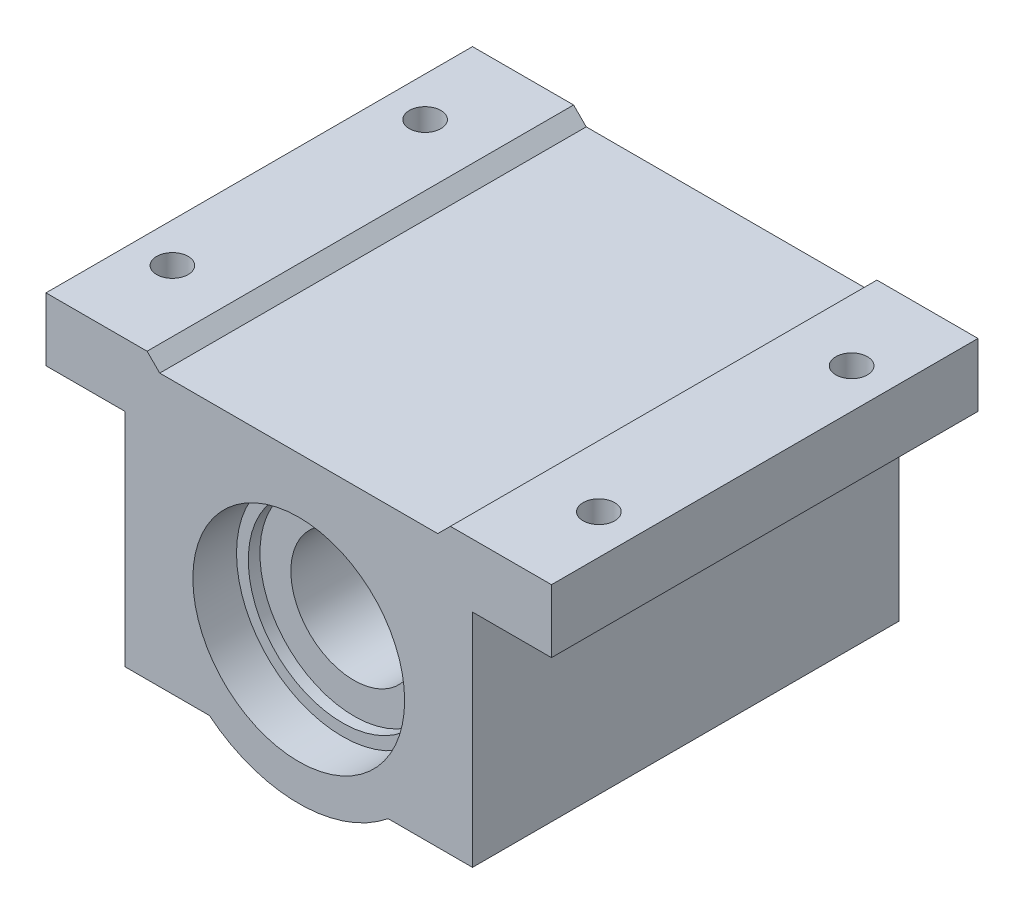
ISO-10303-21;
HEADER;
FILE_DESCRIPTION(('STEP AP214'),'2;1');
FILE_NAME('part.step','',(''),(''),'','','');
FILE_SCHEMA(('AUTOMOTIVE_DESIGN { 1 0 10303 214 1 1 1 1 }'));
ENDSEC;
DATA;
#1=APPLICATION_CONTEXT('core data for automotive mechanical design processes');
#2=APPLICATION_PROTOCOL_DEFINITION('international standard','automotive_design',2000,#1);
#3=PRODUCT_CONTEXT('',#1,'mechanical');
#4=PRODUCT('Part','Part','',(#3));
#5=PRODUCT_RELATED_PRODUCT_CATEGORY('part','',(#4));
#6=PRODUCT_DEFINITION_FORMATION('','',#4);
#7=PRODUCT_DEFINITION_CONTEXT('part definition',#1,'design');
#8=PRODUCT_DEFINITION('design','',#6,#7);
#9=PRODUCT_DEFINITION_SHAPE('','',#8);
#10=(LENGTH_UNIT() NAMED_UNIT(*) SI_UNIT(.MILLI.,.METRE.));
#11=(NAMED_UNIT(*) PLANE_ANGLE_UNIT() SI_UNIT($,.RADIAN.));
#12=(NAMED_UNIT(*) SI_UNIT($,.STERADIAN.) SOLID_ANGLE_UNIT());
#13=UNCERTAINTY_MEASURE_WITH_UNIT(LENGTH_MEASURE(1.E-05),#10,'distance_accuracy_value','');
#14=(GEOMETRIC_REPRESENTATION_CONTEXT(3) GLOBAL_UNCERTAINTY_ASSIGNED_CONTEXT((#13)) GLOBAL_UNIT_ASSIGNED_CONTEXT((#10,
#11,#12)) REPRESENTATION_CONTEXT('',''));
#15=CARTESIAN_POINT('',(0.,0.,0.));
#16=DIRECTION('',(0.,0.,1.));
#17=DIRECTION('',(1.,0.,0.));
#18=AXIS2_PLACEMENT_3D('',#15,#16,#17);
#19=CARTESIAN_POINT('',(0.,0.,15.875));
#20=DIRECTION('',(0.,0.,1.));
#21=DIRECTION('',(1.,0.,0.));
#22=AXIS2_PLACEMENT_3D('',#19,#20,#21);
#23=CYLINDRICAL_SURFACE('',#22,11.8237);
#24=CARTESIAN_POINT('',(0.,0.,15.875));
#25=DIRECTION('',(0.,0.,1.));
#26=DIRECTION('',(1.,0.,0.));
#27=AXIS2_PLACEMENT_3D('',#24,#25,#26);
#28=CIRCLE('',#27,11.8237);
#29=CARTESIAN_POINT('',(11.8237,0.,15.875));
#30=VERTEX_POINT('',#29);
#31=EDGE_CURVE('E11',#30,#30,#28,.T.);
#32=ORIENTED_EDGE('',*,*,#31,.T.);
#33=EDGE_LOOP('',(#32));
#34=FACE_BOUND('',#33,.T.);
#35=CARTESIAN_POINT('',(0.,0.,17.0434));
#36=DIRECTION('',(0.,0.,1.));
#37=DIRECTION('',(1.,0.,0.));
#38=AXIS2_PLACEMENT_3D('',#35,#36,#37);
#39=CIRCLE('',#38,11.8237);
#40=CARTESIAN_POINT('',(11.8237,0.,17.0434));
#41=VERTEX_POINT('',#40);
#42=EDGE_CURVE('E55',#41,#41,#39,.T.);
#43=ORIENTED_EDGE('',*,*,#42,.F.);
#44=EDGE_LOOP('',(#43));
#45=FACE_BOUND('',#44,.T.);
#46=ADVANCED_FACE('F41',(#34,#45),#23,.T.);
#47=CARTESIAN_POINT('',(0.,9.45896,15.875));
#48=DIRECTION('',(0.,0.,-1.));
#49=DIRECTION('',(-1.,0.,0.));
#50=AXIS2_PLACEMENT_3D('',#47,#48,#49);
#51=PLANE('',#50);
#52=CARTESIAN_POINT('',(0.,0.,15.875));
#53=DIRECTION('',(0.,0.,1.));
#54=DIRECTION('',(1.,0.,0.));
#55=AXIS2_PLACEMENT_3D('',#52,#53,#54);
#56=CIRCLE('',#55,9.45896);
#57=CARTESIAN_POINT('',(9.45896,0.,15.875));
#58=VERTEX_POINT('',#57);
#59=EDGE_CURVE('E47',#58,#58,#56,.T.);
#60=ORIENTED_EDGE('',*,*,#59,.T.);
#61=EDGE_LOOP('',(#60));
#62=FACE_BOUND('',#61,.T.);
#63=ORIENTED_EDGE('',*,*,#31,.F.);
#64=EDGE_LOOP('',(#63));
#65=FACE_BOUND('',#64,.T.);
#66=ADVANCED_FACE('F65',(#62,#65),#51,.T.);
#67=CARTESIAN_POINT('',(0.,0.,15.875));
#68=DIRECTION('',(0.,0.,1.));
#69=DIRECTION('',(1.,0.,0.));
#70=AXIS2_PLACEMENT_3D('',#67,#68,#69);
#71=CYLINDRICAL_SURFACE('',#70,9.45896);
#72=CARTESIAN_POINT('',(0.,0.,17.0434));
#73=DIRECTION('',(0.,0.,1.));
#74=DIRECTION('',(1.,0.,0.));
#75=AXIS2_PLACEMENT_3D('',#72,#73,#74);
#76=CIRCLE('',#75,9.45896);
#77=CARTESIAN_POINT('',(9.45896,0.,17.0434));
#78=VERTEX_POINT('',#77);
#79=EDGE_CURVE('E51',#78,#78,#76,.T.);
#80=ORIENTED_EDGE('',*,*,#79,.T.);
#81=EDGE_LOOP('',(#80));
#82=FACE_BOUND('',#81,.T.);
#83=ORIENTED_EDGE('',*,*,#59,.F.);
#84=EDGE_LOOP('',(#83));
#85=FACE_BOUND('',#84,.T.);
#86=ADVANCED_FACE('F69',(#82,#85),#71,.F.);
#87=CARTESIAN_POINT('',(0.,9.45896,17.0434));
#88=DIRECTION('',(0.,0.,1.));
#89=DIRECTION('',(1.,0.,0.));
#90=AXIS2_PLACEMENT_3D('',#87,#88,#89);
#91=PLANE('',#90);
#92=ORIENTED_EDGE('',*,*,#42,.T.);
#93=EDGE_LOOP('',(#92));
#94=FACE_BOUND('',#93,.T.);
#95=ORIENTED_EDGE('',*,*,#79,.F.);
#96=EDGE_LOOP('',(#95));
#97=FACE_BOUND('',#96,.T.);
#98=ADVANCED_FACE('F61',(#94,#97),#91,.T.);
#99=CLOSED_SHELL('',(#46,#66,#86,#98));
#100=MANIFOLD_SOLID_BREP('B2',#99);
#101=CARTESIAN_POINT('',(0.,0.,15.875));
#102=DIRECTION('',(0.,0.,1.));
#103=DIRECTION('',(1.,0.,0.));
#104=AXIS2_PLACEMENT_3D('',#101,#102,#103);
#105=CYLINDRICAL_SURFACE('',#104,11.8237);
#106=CARTESIAN_POINT('',(0.,0.,-17.0434));
#107=DIRECTION('',(0.,0.,1.));
#108=DIRECTION('',(1.,0.,0.));
#109=AXIS2_PLACEMENT_3D('',#106,#107,#108);
#110=CIRCLE('',#109,11.8237);
#111=CARTESIAN_POINT('',(11.8237,0.,-17.0434));
#112=VERTEX_POINT('',#111);
#113=EDGE_CURVE('E124',#112,#112,#110,.T.);
#114=ORIENTED_EDGE('',*,*,#113,.T.);
#115=EDGE_LOOP('',(#114));
#116=FACE_BOUND('',#115,.T.);
#117=CARTESIAN_POINT('',(0.,0.,-15.875));
#118=DIRECTION('',(0.,0.,1.));
#119=DIRECTION('',(1.,0.,0.));
#120=AXIS2_PLACEMENT_3D('',#117,#118,#119);
#121=CIRCLE('',#120,11.8237);
#122=CARTESIAN_POINT('',(11.8237,0.,-15.875));
#123=VERTEX_POINT('',#122);
#124=EDGE_CURVE('E40',#123,#123,#121,.T.);
#125=ORIENTED_EDGE('',*,*,#124,.F.);
#126=EDGE_LOOP('',(#125));
#127=FACE_BOUND('',#126,.T.);
#128=ADVANCED_FACE('F110',(#116,#127),#105,.T.);
#129=CARTESIAN_POINT('',(0.,9.45896,-15.875));
#130=DIRECTION('',(0.,0.,1.));
#131=DIRECTION('',(1.,0.,0.));
#132=AXIS2_PLACEMENT_3D('',#129,#130,#131);
#133=PLANE('',#132);
#134=ORIENTED_EDGE('',*,*,#124,.T.);
#135=EDGE_LOOP('',(#134));
#136=FACE_BOUND('',#135,.T.);
#137=CARTESIAN_POINT('',(0.,0.,-15.875));
#138=DIRECTION('',(0.,0.,1.));
#139=DIRECTION('',(1.,0.,0.));
#140=AXIS2_PLACEMENT_3D('',#137,#138,#139);
#141=CIRCLE('',#140,9.45896);
#142=CARTESIAN_POINT('',(9.45896,0.,-15.875));
#143=VERTEX_POINT('',#142);
#144=EDGE_CURVE('E116',#143,#143,#141,.T.);
#145=ORIENTED_EDGE('',*,*,#144,.F.);
#146=EDGE_LOOP('',(#145));
#147=FACE_BOUND('',#146,.T.);
#148=ADVANCED_FACE('F140',(#136,#147),#133,.T.);
#149=CARTESIAN_POINT('',(0.,0.,15.875));
#150=DIRECTION('',(0.,0.,1.));
#151=DIRECTION('',(1.,0.,0.));
#152=AXIS2_PLACEMENT_3D('',#149,#150,#151);
#153=CYLINDRICAL_SURFACE('',#152,9.45896);
#154=ORIENTED_EDGE('',*,*,#144,.T.);
#155=EDGE_LOOP('',(#154));
#156=FACE_BOUND('',#155,.T.);
#157=CARTESIAN_POINT('',(0.,0.,-17.0434));
#158=DIRECTION('',(0.,0.,1.));
#159=DIRECTION('',(1.,0.,0.));
#160=AXIS2_PLACEMENT_3D('',#157,#158,#159);
#161=CIRCLE('',#160,9.45896);
#162=CARTESIAN_POINT('',(9.45896,0.,-17.0434));
#163=VERTEX_POINT('',#162);
#164=EDGE_CURVE('E120',#163,#163,#161,.T.);
#165=ORIENTED_EDGE('',*,*,#164,.F.);
#166=EDGE_LOOP('',(#165));
#167=FACE_BOUND('',#166,.T.);
#168=ADVANCED_FACE('F134',(#156,#167),#153,.F.);
#169=CARTESIAN_POINT('',(0.,9.45896,-17.0434));
#170=DIRECTION('',(0.,0.,-1.));
#171=DIRECTION('',(-1.,0.,0.));
#172=AXIS2_PLACEMENT_3D('',#169,#170,#171);
#173=PLANE('',#172);
#174=ORIENTED_EDGE('',*,*,#164,.T.);
#175=EDGE_LOOP('',(#174));
#176=FACE_BOUND('',#175,.T.);
#177=ORIENTED_EDGE('',*,*,#113,.F.);
#178=EDGE_LOOP('',(#177));
#179=FACE_BOUND('',#178,.T.);
#180=ADVANCED_FACE('F132',(#176,#179),#173,.T.);
#181=CLOSED_SHELL('',(#128,#148,#168,#180));
#182=MANIFOLD_SOLID_BREP('B6',#181);
#183=CARTESIAN_POINT('',(0.,0.,15.875));
#184=DIRECTION('',(0.,0.,1.));
#185=DIRECTION('',(1.,0.,0.));
#186=AXIS2_PLACEMENT_3D('',#183,#184,#185);
#187=PLANE('',#186);
#188=CARTESIAN_POINT('',(0.,0.,15.875));
#189=DIRECTION('',(0.,0.,1.));
#190=DIRECTION('',(1.,0.,0.));
#191=AXIS2_PLACEMENT_3D('',#188,#189,#190);
#192=CIRCLE('',#191,10.64133);
#193=CARTESIAN_POINT('',(10.64133,0.,15.875));
#194=VERTEX_POINT('',#193);
#195=EDGE_CURVE('E109',#194,#194,#192,.T.);
#196=ORIENTED_EDGE('',*,*,#195,.T.);
#197=EDGE_LOOP('',(#196));
#198=FACE_BOUND('',#197,.T.);
#199=CARTESIAN_POINT('',(0.,0.,15.875));
#200=DIRECTION('',(0.,0.,1.));
#201=DIRECTION('',(1.,0.,0.));
#202=AXIS2_PLACEMENT_3D('',#199,#200,#201);
#203=CIRCLE('',#202,6.35);
#204=CARTESIAN_POINT('',(6.35,0.,15.875));
#205=VERTEX_POINT('',#204);
#206=EDGE_CURVE('E191',#205,#205,#203,.T.);
#207=ORIENTED_EDGE('',*,*,#206,.F.);
#208=EDGE_LOOP('',(#207));
#209=FACE_BOUND('',#208,.T.);
#210=ADVANCED_FACE('F180',(#198,#209),#187,.T.);
#211=CARTESIAN_POINT('',(0.,0.,-15.875));
#212=DIRECTION('',(0.,0.,1.));
#213=DIRECTION('',(1.,0.,0.));
#214=AXIS2_PLACEMENT_3D('',#211,#212,#213);
#215=PLANE('',#214);
#216=CARTESIAN_POINT('',(0.,0.,-15.875));
#217=DIRECTION('',(0.,0.,1.));
#218=DIRECTION('',(1.,0.,0.));
#219=AXIS2_PLACEMENT_3D('',#216,#217,#218);
#220=CIRCLE('',#219,10.64133);
#221=CARTESIAN_POINT('',(10.64133,0.,-15.875));
#222=VERTEX_POINT('',#221);
#223=EDGE_CURVE('E184',#222,#222,#220,.T.);
#224=ORIENTED_EDGE('',*,*,#223,.F.);
#225=EDGE_LOOP('',(#224));
#226=FACE_BOUND('',#225,.T.);
#227=CARTESIAN_POINT('',(0.,0.,-15.875));
#228=DIRECTION('',(0.,0.,1.));
#229=DIRECTION('',(1.,0.,0.));
#230=AXIS2_PLACEMENT_3D('',#227,#228,#229);
#231=CIRCLE('',#230,6.35);
#232=CARTESIAN_POINT('',(6.35,0.,-15.875));
#233=VERTEX_POINT('',#232);
#234=EDGE_CURVE('E193',#233,#233,#231,.T.);
#235=ORIENTED_EDGE('',*,*,#234,.T.);
#236=EDGE_LOOP('',(#235));
#237=FACE_BOUND('',#236,.T.);
#238=ADVANCED_FACE('F203',(#226,#237),#215,.F.);
#239=CARTESIAN_POINT('',(0.,0.,15.875));
#240=DIRECTION('',(0.,0.,-1.));
#241=DIRECTION('',(-1.,0.,0.));
#242=AXIS2_PLACEMENT_3D('',#239,#240,#241);
#243=CYLINDRICAL_SURFACE('',#242,10.64133);
#244=ORIENTED_EDGE('',*,*,#195,.F.);
#245=EDGE_LOOP('',(#244));
#246=FACE_BOUND('',#245,.T.);
#247=ORIENTED_EDGE('',*,*,#223,.T.);
#248=EDGE_LOOP('',(#247));
#249=FACE_BOUND('',#248,.T.);
#250=ADVANCED_FACE('F182',(#246,#249),#243,.T.);
#251=CARTESIAN_POINT('',(0.,0.,15.875));
#252=DIRECTION('',(0.,0.,-1.));
#253=DIRECTION('',(-1.,0.,0.));
#254=AXIS2_PLACEMENT_3D('',#251,#252,#253);
#255=CYLINDRICAL_SURFACE('',#254,6.35);
#256=ORIENTED_EDGE('',*,*,#206,.T.);
#257=EDGE_LOOP('',(#256));
#258=FACE_BOUND('',#257,.T.);
#259=ORIENTED_EDGE('',*,*,#234,.F.);
#260=EDGE_LOOP('',(#259));
#261=FACE_BOUND('',#260,.T.);
#262=ADVANCED_FACE('F199',(#258,#261),#255,.F.);
#263=CLOSED_SHELL('',(#210,#238,#250,#262));
#264=MANIFOLD_SOLID_BREP('B35',#263);
#265=CARTESIAN_POINT('',(0.,0.,21.43125));
#266=DIRECTION('',(0.,0.,-1.));
#267=DIRECTION('',(-1.,0.,0.));
#268=AXIS2_PLACEMENT_3D('',#265,#266,#267);
#269=CYLINDRICAL_SURFACE('',#268,10.64133);
#270=CARTESIAN_POINT('',(0.,0.,15.875));
#271=DIRECTION('',(0.,0.,-1.));
#272=DIRECTION('',(-1.,0.,0.));
#273=AXIS2_PLACEMENT_3D('',#270,#271,#272);
#274=CIRCLE('',#273,10.64133);
#275=CARTESIAN_POINT('',(-10.64133,0.,15.875));
#276=VERTEX_POINT('',#275);
#277=EDGE_CURVE('E245',#276,#276,#274,.T.);
#278=ORIENTED_EDGE('',*,*,#277,.F.);
#279=EDGE_LOOP('',(#278));
#280=FACE_BOUND('',#279,.T.);
#281=CARTESIAN_POINT('',(0.,0.,-15.875));
#282=DIRECTION('',(0.,0.,1.));
#283=DIRECTION('',(1.,0.,0.));
#284=AXIS2_PLACEMENT_3D('',#281,#282,#283);
#285=CIRCLE('',#284,10.64133);
#286=CARTESIAN_POINT('',(10.64133,0.,-15.875));
#287=VERTEX_POINT('',#286);
#288=EDGE_CURVE('E437',#287,#287,#285,.T.);
#289=ORIENTED_EDGE('',*,*,#288,.F.);
#290=EDGE_LOOP('',(#289));
#291=FACE_BOUND('',#290,.T.);
#292=ADVANCED_FACE('F241',(#280,#291),#269,.F.);
#293=CARTESIAN_POINT('',(0.,0.,17.0434));
#294=DIRECTION('',(0.,0.,1.));
#295=DIRECTION('',(1.,0.,0.));
#296=AXIS2_PLACEMENT_3D('',#293,#294,#295);
#297=CIRCLE('',#296,10.64133);
#298=CARTESIAN_POINT('',(10.64133,0.,17.0434));
#299=VERTEX_POINT('',#298);
#300=EDGE_CURVE('E441',#299,#299,#297,.T.);
#301=ORIENTED_EDGE('',*,*,#300,.F.);
#302=EDGE_LOOP('',(#301));
#303=FACE_BOUND('',#302,.T.);
#304=CARTESIAN_POINT('',(0.,0.,21.43125));
#305=DIRECTION('',(0.,0.,1.));
#306=DIRECTION('',(1.,0.,0.));
#307=AXIS2_PLACEMENT_3D('',#304,#305,#306);
#308=CIRCLE('',#307,10.64133);
#309=CARTESIAN_POINT('',(10.64133,0.,21.43125));
#310=VERTEX_POINT('',#309);
#311=EDGE_CURVE('E381',#310,#310,#308,.T.);
#312=ORIENTED_EDGE('',*,*,#311,.T.);
#313=EDGE_LOOP('',(#312));
#314=FACE_BOUND('',#313,.T.);
#315=ADVANCED_FACE('F534',(#303,#314),#269,.F.);
#316=CARTESIAN_POINT('',(0.,0.,21.43125));
#317=DIRECTION('',(0.,0.,1.));
#318=DIRECTION('',(1.,0.,0.));
#319=AXIS2_PLACEMENT_3D('',#316,#317,#318);
#320=PLANE('',#319);
#321=DIRECTION('',(0.,1.,0.));
#322=VECTOR('',#321,1.);
#323=CARTESIAN_POINT('',(17.4625,-11.1125,21.43125));
#324=LINE('',#323,#322);
#325=CARTESIAN_POINT('',(17.4625,-11.1125,21.43125));
#326=VERTEX_POINT('',#325);
#327=CARTESIAN_POINT('',(17.4625,11.1125,21.43125));
#328=VERTEX_POINT('',#327);
#329=EDGE_CURVE('E404',#326,#328,#324,.T.);
#330=ORIENTED_EDGE('',*,*,#329,.T.);
#331=DIRECTION('',(1.,0.,0.));
#332=VECTOR('',#331,1.);
#333=CARTESIAN_POINT('',(17.4625,11.1125,21.43125));
#334=LINE('',#333,#332);
#335=CARTESIAN_POINT('',(25.4,11.1125,21.43125));
#336=VERTEX_POINT('',#335);
#337=EDGE_CURVE('E321',#328,#336,#334,.T.);
#338=ORIENTED_EDGE('',*,*,#337,.T.);
#339=DIRECTION('',(0.,1.,0.));
#340=VECTOR('',#339,1.);
#341=CARTESIAN_POINT('',(25.4,11.1125,21.43125));
#342=LINE('',#341,#340);
#343=CARTESIAN_POINT('',(25.4,17.4625,21.43125));
#344=VERTEX_POINT('',#343);
#345=EDGE_CURVE('E490',#336,#344,#342,.T.);
#346=ORIENTED_EDGE('',*,*,#345,.T.);
#347=DIRECTION('',(-1.,0.,0.));
#348=VECTOR('',#347,1.);
#349=CARTESIAN_POINT('',(15.24,17.4625,21.43125));
#350=LINE('',#349,#348);
#351=CARTESIAN_POINT('',(15.24,17.4625,21.43125));
#352=VERTEX_POINT('',#351);
#353=EDGE_CURVE('E492',#344,#352,#350,.T.);
#354=ORIENTED_EDGE('',*,*,#353,.T.);
#355=DIRECTION('',(-0.707106781186547,-0.707106781186549,0.));
#356=VECTOR('',#355,1.);
#357=CARTESIAN_POINT('',(13.97,16.1925,21.43125));
#358=LINE('',#357,#356);
#359=CARTESIAN_POINT('',(13.97,16.1925,21.43125));
#360=VERTEX_POINT('',#359);
#361=EDGE_CURVE('E494',#352,#360,#358,.T.);
#362=ORIENTED_EDGE('',*,*,#361,.T.);
#363=DIRECTION('',(-1.,0.,0.));
#364=VECTOR('',#363,1.);
#365=CARTESIAN_POINT('',(-13.97,16.1925,21.43125));
#366=LINE('',#365,#364);
#367=CARTESIAN_POINT('',(-13.97,16.1925,21.43125));
#368=VERTEX_POINT('',#367);
#369=EDGE_CURVE('E496',#360,#368,#366,.T.);
#370=ORIENTED_EDGE('',*,*,#369,.T.);
#371=DIRECTION('',(-0.707106781186543,0.707106781186552,0.));
#372=VECTOR('',#371,1.);
#373=CARTESIAN_POINT('',(-15.24,17.4625,21.43125));
#374=LINE('',#373,#372);
#375=CARTESIAN_POINT('',(-15.24,17.4625,21.43125));
#376=VERTEX_POINT('',#375);
#377=EDGE_CURVE('E498',#368,#376,#374,.T.);
#378=ORIENTED_EDGE('',*,*,#377,.T.);
#379=DIRECTION('',(-1.,0.,0.));
#380=VECTOR('',#379,1.);
#381=CARTESIAN_POINT('',(-15.24,17.4625,21.43125));
#382=LINE('',#381,#380);
#383=CARTESIAN_POINT('',(-25.4,17.4625,21.43125));
#384=VERTEX_POINT('',#383);
#385=EDGE_CURVE('E500',#376,#384,#382,.T.);
#386=ORIENTED_EDGE('',*,*,#385,.T.);
#387=DIRECTION('',(0.,-1.,0.));
#388=VECTOR('',#387,1.);
#389=CARTESIAN_POINT('',(-25.4,11.1125,21.43125));
#390=LINE('',#389,#388);
#391=CARTESIAN_POINT('',(-25.4,11.1125,21.43125));
#392=VERTEX_POINT('',#391);
#393=EDGE_CURVE('E502',#384,#392,#390,.T.);
#394=ORIENTED_EDGE('',*,*,#393,.T.);
#395=DIRECTION('',(1.,0.,0.));
#396=VECTOR('',#395,1.);
#397=CARTESIAN_POINT('',(-17.4625,11.1125,21.43125));
#398=LINE('',#397,#396);
#399=CARTESIAN_POINT('',(-17.4625,11.1125,21.43125));
#400=VERTEX_POINT('',#399);
#401=EDGE_CURVE('E504',#392,#400,#398,.T.);
#402=ORIENTED_EDGE('',*,*,#401,.T.);
#403=DIRECTION('',(0.,-1.,0.));
#404=VECTOR('',#403,1.);
#405=CARTESIAN_POINT('',(-17.4625,11.1125,21.43125));
#406=LINE('',#405,#404);
#407=CARTESIAN_POINT('',(-17.4625,-11.1125,21.43125));
#408=VERTEX_POINT('',#407);
#409=EDGE_CURVE('E359',#400,#408,#406,.T.);
#410=ORIENTED_EDGE('',*,*,#409,.T.);
#411=DIRECTION('',(1.,0.,0.));
#412=VECTOR('',#411,1.);
#413=CARTESIAN_POINT('',(-17.4625,-11.1125,21.43125));
#414=LINE('',#413,#412);
#415=CARTESIAN_POINT('',(-8.98025612106917,-11.1125,21.43125));
#416=VERTEX_POINT('',#415);
#417=EDGE_CURVE('E352',#408,#416,#414,.T.);
#418=ORIENTED_EDGE('',*,*,#417,.T.);
#419=CARTESIAN_POINT('',(0.,0.,21.43125));
#420=DIRECTION('',(0.,0.,1.));
#421=DIRECTION('',(1.,0.,0.));
#422=AXIS2_PLACEMENT_3D('',#419,#420,#421);
#423=CIRCLE('',#422,14.2875);
#424=CARTESIAN_POINT('',(8.98025612106917,-11.1125,21.43125));
#425=VERTEX_POINT('',#424);
#426=EDGE_CURVE('E357',#416,#425,#423,.T.);
#427=ORIENTED_EDGE('',*,*,#426,.T.);
#428=DIRECTION('',(1.,0.,0.));
#429=VECTOR('',#428,1.);
#430=CARTESIAN_POINT('',(8.98025612106917,-11.1125,21.43125));
#431=LINE('',#430,#429);
#432=EDGE_CURVE('E260',#425,#326,#431,.T.);
#433=ORIENTED_EDGE('',*,*,#432,.T.);
#434=EDGE_LOOP('',(#330,#338,#346,#354,#362,#370,#378,#386,#394,#402,#410,#418,#427,#433));
#435=FACE_BOUND('',#434,.T.);
#436=ORIENTED_EDGE('',*,*,#311,.F.);
#437=EDGE_LOOP('',(#436));
#438=FACE_BOUND('',#437,.T.);
#439=ADVANCED_FACE('F354',(#435,#438),#320,.T.);
#440=CARTESIAN_POINT('',(0.,0.,-21.43125));
#441=DIRECTION('',(0.,0.,1.));
#442=DIRECTION('',(1.,0.,0.));
#443=AXIS2_PLACEMENT_3D('',#440,#441,#442);
#444=PLANE('',#443);
#445=DIRECTION('',(0.,1.,0.));
#446=VECTOR('',#445,1.);
#447=CARTESIAN_POINT('',(17.4625,-11.1125,-21.43125));
#448=LINE('',#447,#446);
#449=CARTESIAN_POINT('',(17.4625,-11.1125,-21.43125));
#450=VERTEX_POINT('',#449);
#451=CARTESIAN_POINT('',(17.4625,11.1125,-21.43125));
#452=VERTEX_POINT('',#451);
#453=EDGE_CURVE('E377',#450,#452,#448,.T.);
#454=ORIENTED_EDGE('',*,*,#453,.F.);
#455=DIRECTION('',(1.,0.,0.));
#456=VECTOR('',#455,1.);
#457=CARTESIAN_POINT('',(8.98025612106917,-11.1125,-21.43125));
#458=LINE('',#457,#456);
#459=CARTESIAN_POINT('',(8.98025612106917,-11.1125,-21.43125));
#460=VERTEX_POINT('',#459);
#461=EDGE_CURVE('E313',#460,#450,#458,.T.);
#462=ORIENTED_EDGE('',*,*,#461,.F.);
#463=CARTESIAN_POINT('',(0.,0.,-21.43125));
#464=DIRECTION('',(0.,0.,1.));
#465=DIRECTION('',(1.,0.,0.));
#466=AXIS2_PLACEMENT_3D('',#463,#464,#465);
#467=CIRCLE('',#466,14.2875);
#468=CARTESIAN_POINT('',(-8.98025612106917,-11.1125,-21.43125));
#469=VERTEX_POINT('',#468);
#470=EDGE_CURVE('E307',#469,#460,#467,.T.);
#471=ORIENTED_EDGE('',*,*,#470,.F.);
#472=DIRECTION('',(1.,0.,0.));
#473=VECTOR('',#472,1.);
#474=CARTESIAN_POINT('',(-17.4625,-11.1125,-21.43125));
#475=LINE('',#474,#473);
#476=CARTESIAN_POINT('',(-17.4625,-11.1125,-21.43125));
#477=VERTEX_POINT('',#476);
#478=EDGE_CURVE('E367',#477,#469,#475,.T.);
#479=ORIENTED_EDGE('',*,*,#478,.F.);
#480=DIRECTION('',(0.,-1.,0.));
#481=VECTOR('',#480,1.);
#482=CARTESIAN_POINT('',(-17.4625,11.1125,-21.43125));
#483=LINE('',#482,#481);
#484=CARTESIAN_POINT('',(-17.4625,11.1125,-21.43125));
#485=VERTEX_POINT('',#484);
#486=EDGE_CURVE('E399',#485,#477,#483,.T.);
#487=ORIENTED_EDGE('',*,*,#486,.F.);
#488=DIRECTION('',(1.,0.,0.));
#489=VECTOR('',#488,1.);
#490=CARTESIAN_POINT('',(-17.4625,11.1125,-21.43125));
#491=LINE('',#490,#489);
#492=CARTESIAN_POINT('',(-25.4,11.1125,-21.43125));
#493=VERTEX_POINT('',#492);
#494=EDGE_CURVE('E397',#493,#485,#491,.T.);
#495=ORIENTED_EDGE('',*,*,#494,.F.);
#496=DIRECTION('',(0.,-1.,0.));
#497=VECTOR('',#496,1.);
#498=CARTESIAN_POINT('',(-25.4,11.1125,-21.43125));
#499=LINE('',#498,#497);
#500=CARTESIAN_POINT('',(-25.4,17.4625,-21.43125));
#501=VERTEX_POINT('',#500);
#502=EDGE_CURVE('E395',#501,#493,#499,.T.);
#503=ORIENTED_EDGE('',*,*,#502,.F.);
#504=DIRECTION('',(-1.,0.,0.));
#505=VECTOR('',#504,1.);
#506=CARTESIAN_POINT('',(-15.24,17.4625,-21.43125));
#507=LINE('',#506,#505);
#508=CARTESIAN_POINT('',(-15.24,17.4625,-21.43125));
#509=VERTEX_POINT('',#508);
#510=EDGE_CURVE('E393',#509,#501,#507,.T.);
#511=ORIENTED_EDGE('',*,*,#510,.F.);
#512=DIRECTION('',(-0.707106781186543,0.707106781186552,0.));
#513=VECTOR('',#512,1.);
#514=CARTESIAN_POINT('',(-15.24,17.4625,-21.43125));
#515=LINE('',#514,#513);
#516=CARTESIAN_POINT('',(-13.97,16.1925,-21.43125));
#517=VERTEX_POINT('',#516);
#518=EDGE_CURVE('E391',#517,#509,#515,.T.);
#519=ORIENTED_EDGE('',*,*,#518,.F.);
#520=DIRECTION('',(-1.,0.,0.));
#521=VECTOR('',#520,1.);
#522=CARTESIAN_POINT('',(-13.97,16.1925,-21.43125));
#523=LINE('',#522,#521);
#524=CARTESIAN_POINT('',(13.97,16.1925,-21.43125));
#525=VERTEX_POINT('',#524);
#526=EDGE_CURVE('E389',#525,#517,#523,.T.);
#527=ORIENTED_EDGE('',*,*,#526,.F.);
#528=DIRECTION('',(-0.707106781186547,-0.707106781186549,0.));
#529=VECTOR('',#528,1.);
#530=CARTESIAN_POINT('',(13.97,16.1925,-21.43125));
#531=LINE('',#530,#529);
#532=CARTESIAN_POINT('',(15.24,17.4625,-21.43125));
#533=VERTEX_POINT('',#532);
#534=EDGE_CURVE('E387',#533,#525,#531,.T.);
#535=ORIENTED_EDGE('',*,*,#534,.F.);
#536=DIRECTION('',(-1.,0.,0.));
#537=VECTOR('',#536,1.);
#538=CARTESIAN_POINT('',(15.24,17.4625,-21.43125));
#539=LINE('',#538,#537);
#540=CARTESIAN_POINT('',(25.4,17.4625,-21.43125));
#541=VERTEX_POINT('',#540);
#542=EDGE_CURVE('E385',#541,#533,#539,.T.);
#543=ORIENTED_EDGE('',*,*,#542,.F.);
#544=DIRECTION('',(0.,1.,0.));
#545=VECTOR('',#544,1.);
#546=CARTESIAN_POINT('',(25.4,11.1125,-21.43125));
#547=LINE('',#546,#545);
#548=CARTESIAN_POINT('',(25.4,11.1125,-21.43125));
#549=VERTEX_POINT('',#548);
#550=EDGE_CURVE('E383',#549,#541,#547,.T.);
#551=ORIENTED_EDGE('',*,*,#550,.F.);
#552=DIRECTION('',(1.,0.,0.));
#553=VECTOR('',#552,1.);
#554=CARTESIAN_POINT('',(17.4625,11.1125,-21.43125));
#555=LINE('',#554,#553);
#556=EDGE_CURVE('E380',#452,#549,#555,.T.);
#557=ORIENTED_EDGE('',*,*,#556,.F.);
#558=EDGE_LOOP('',(#454,#462,#471,#479,#487,#495,#503,#511,#519,#527,#535,#543,#551,#557));
#559=FACE_BOUND('',#558,.T.);
#560=CARTESIAN_POINT('',(0.,0.,-21.43125));
#561=DIRECTION('',(0.,0.,1.));
#562=DIRECTION('',(1.,0.,0.));
#563=AXIS2_PLACEMENT_3D('',#560,#561,#562);
#564=CIRCLE('',#563,10.64133);
#565=CARTESIAN_POINT('',(10.64133,0.,-21.43125));
#566=VERTEX_POINT('',#565);
#567=EDGE_CURVE('E483',#566,#566,#564,.T.);
#568=ORIENTED_EDGE('',*,*,#567,.T.);
#569=EDGE_LOOP('',(#568));
#570=FACE_BOUND('',#569,.T.);
#571=ADVANCED_FACE('F517',(#559,#570),#444,.F.);
#572=CARTESIAN_POINT('',(17.4625,-11.1125,21.43125));
#573=DIRECTION('',(-1.,0.,0.));
#574=DIRECTION('',(0.,0.,1.));
#575=AXIS2_PLACEMENT_3D('',#572,#573,#574);
#576=PLANE('',#575);
#577=ORIENTED_EDGE('',*,*,#453,.T.);
#578=DIRECTION('',(0.,0.,-1.));
#579=VECTOR('',#578,1.);
#580=CARTESIAN_POINT('',(17.4625,11.1125,21.43125));
#581=LINE('',#580,#579);
#582=EDGE_CURVE('E178',#328,#452,#581,.T.);
#583=ORIENTED_EDGE('',*,*,#582,.F.);
#584=ORIENTED_EDGE('',*,*,#329,.F.);
#585=DIRECTION('',(0.,0.,-1.));
#586=VECTOR('',#585,1.);
#587=CARTESIAN_POINT('',(17.4625,-11.1125,21.43125));
#588=LINE('',#587,#586);
#589=EDGE_CURVE('E373',#326,#450,#588,.T.);
#590=ORIENTED_EDGE('',*,*,#589,.T.);
#591=EDGE_LOOP('',(#577,#583,#584,#590));
#592=FACE_BOUND('',#591,.T.);
#593=ADVANCED_FACE('F243',(#592),#576,.F.);
#594=CARTESIAN_POINT('',(17.4625,11.1125,21.43125));
#595=DIRECTION('',(0.,1.,0.));
#596=DIRECTION('',(-1.,0.,0.));
#597=AXIS2_PLACEMENT_3D('',#594,#595,#596);
#598=PLANE('',#597);
#599=CARTESIAN_POINT('',(21.43125,11.1125,12.7));
#600=DIRECTION('',(0.,1.,0.));
#601=DIRECTION('',(-1.,0.,0.));
#602=AXIS2_PLACEMENT_3D('',#599,#600,#601);
#603=CIRCLE('',#602,1.5875);
#604=CARTESIAN_POINT('',(19.84375,11.1125,12.7));
#605=VERTEX_POINT('',#604);
#606=EDGE_CURVE('E468',#605,#605,#603,.F.);
#607=ORIENTED_EDGE('',*,*,#606,.F.);
#608=EDGE_LOOP('',(#607));
#609=FACE_BOUND('',#608,.T.);
#610=CARTESIAN_POINT('',(21.43125,11.1125,-12.7));
#611=DIRECTION('',(0.,1.,0.));
#612=DIRECTION('',(-1.,0.,0.));
#613=AXIS2_PLACEMENT_3D('',#610,#611,#612);
#614=CIRCLE('',#613,1.5875);
#615=CARTESIAN_POINT('',(19.84375,11.1125,-12.7));
#616=VERTEX_POINT('',#615);
#617=EDGE_CURVE('E474',#616,#616,#614,.F.);
#618=ORIENTED_EDGE('',*,*,#617,.F.);
#619=EDGE_LOOP('',(#618));
#620=FACE_BOUND('',#619,.T.);
#621=ORIENTED_EDGE('',*,*,#556,.T.);
#622=DIRECTION('',(0.,0.,-1.));
#623=VECTOR('',#622,1.);
#624=CARTESIAN_POINT('',(25.4,11.1125,21.43125));
#625=LINE('',#624,#623);
#626=EDGE_CURVE('E251',#336,#549,#625,.T.);
#627=ORIENTED_EDGE('',*,*,#626,.F.);
#628=ORIENTED_EDGE('',*,*,#337,.F.);
#629=ORIENTED_EDGE('',*,*,#582,.T.);
#630=EDGE_LOOP('',(#621,#627,#628,#629));
#631=FACE_BOUND('',#630,.T.);
#632=ADVANCED_FACE('F553',(#609,#620,#631),#598,.F.);
#633=CARTESIAN_POINT('',(25.4,11.1125,21.43125));
#634=DIRECTION('',(-1.,0.,0.));
#635=DIRECTION('',(0.,-1.,0.));
#636=AXIS2_PLACEMENT_3D('',#633,#634,#635);
#637=PLANE('',#636);
#638=ORIENTED_EDGE('',*,*,#550,.T.);
#639=DIRECTION('',(0.,0.,-1.));
#640=VECTOR('',#639,1.);
#641=CARTESIAN_POINT('',(25.4,17.4625,21.43125));
#642=LINE('',#641,#640);
#643=EDGE_CURVE('E429',#344,#541,#642,.T.);
#644=ORIENTED_EDGE('',*,*,#643,.F.);
#645=ORIENTED_EDGE('',*,*,#345,.F.);
#646=ORIENTED_EDGE('',*,*,#626,.T.);
#647=EDGE_LOOP('',(#638,#644,#645,#646));
#648=FACE_BOUND('',#647,.T.);
#649=ADVANCED_FACE('F557',(#648),#637,.F.);
#650=CARTESIAN_POINT('',(15.24,17.4625,21.43125));
#651=DIRECTION('',(0.,-1.,0.));
#652=DIRECTION('',(0.,0.,-1.));
#653=AXIS2_PLACEMENT_3D('',#650,#651,#652);
#654=PLANE('',#653);
#655=CARTESIAN_POINT('',(21.43125,17.4625,12.7));
#656=DIRECTION('',(0.,1.,0.));
#657=DIRECTION('',(0.,0.,1.));
#658=AXIS2_PLACEMENT_3D('',#655,#656,#657);
#659=CIRCLE('',#658,1.5875);
#660=CARTESIAN_POINT('',(21.43125,17.4625,14.2875));
#661=VERTEX_POINT('',#660);
#662=EDGE_CURVE('E465',#661,#661,#659,.T.);
#663=ORIENTED_EDGE('',*,*,#662,.F.);
#664=EDGE_LOOP('',(#663));
#665=FACE_BOUND('',#664,.T.);
#666=CARTESIAN_POINT('',(21.43125,17.4625,-12.7));
#667=DIRECTION('',(0.,1.,0.));
#668=DIRECTION('',(0.,0.,1.));
#669=AXIS2_PLACEMENT_3D('',#666,#667,#668);
#670=CIRCLE('',#669,1.5875);
#671=CARTESIAN_POINT('',(21.43125,17.4625,-11.1125));
#672=VERTEX_POINT('',#671);
#673=EDGE_CURVE('E471',#672,#672,#670,.T.);
#674=ORIENTED_EDGE('',*,*,#673,.F.);
#675=EDGE_LOOP('',(#674));
#676=FACE_BOUND('',#675,.T.);
#677=ORIENTED_EDGE('',*,*,#542,.T.);
#678=DIRECTION('',(0.,0.,-1.));
#679=VECTOR('',#678,1.);
#680=CARTESIAN_POINT('',(15.24,17.4625,21.43125));
#681=LINE('',#680,#679);
#682=EDGE_CURVE('E426',#352,#533,#681,.T.);
#683=ORIENTED_EDGE('',*,*,#682,.F.);
#684=ORIENTED_EDGE('',*,*,#353,.F.);
#685=ORIENTED_EDGE('',*,*,#643,.T.);
#686=EDGE_LOOP('',(#677,#683,#684,#685));
#687=FACE_BOUND('',#686,.T.);
#688=ADVANCED_FACE('F562',(#665,#676,#687),#654,.F.);
#689=CARTESIAN_POINT('',(13.97,16.1925,21.43125));
#690=DIRECTION('',(0.707106781186549,-0.707106781186547,0.));
#691=DIRECTION('',(0.707106781186547,0.707106781186549,0.));
#692=AXIS2_PLACEMENT_3D('',#689,#690,#691);
#693=PLANE('',#692);
#694=ORIENTED_EDGE('',*,*,#534,.T.);
#695=DIRECTION('',(0.,0.,-1.));
#696=VECTOR('',#695,1.);
#697=CARTESIAN_POINT('',(13.97,16.1925,21.43125));
#698=LINE('',#697,#696);
#699=EDGE_CURVE('E423',#360,#525,#698,.T.);
#700=ORIENTED_EDGE('',*,*,#699,.F.);
#701=ORIENTED_EDGE('',*,*,#361,.F.);
#702=ORIENTED_EDGE('',*,*,#682,.T.);
#703=EDGE_LOOP('',(#694,#700,#701,#702));
#704=FACE_BOUND('',#703,.T.);
#705=ADVANCED_FACE('F570',(#704),#693,.F.);
#706=CARTESIAN_POINT('',(-13.97,16.1925,21.43125));
#707=DIRECTION('',(0.,-1.,0.));
#708=DIRECTION('',(0.,0.,-1.));
#709=AXIS2_PLACEMENT_3D('',#706,#707,#708);
#710=PLANE('',#709);
#711=ORIENTED_EDGE('',*,*,#526,.T.);
#712=DIRECTION('',(0.,0.,-1.));
#713=VECTOR('',#712,1.);
#714=CARTESIAN_POINT('',(-13.97,16.1925,21.43125));
#715=LINE('',#714,#713);
#716=EDGE_CURVE('E420',#368,#517,#715,.T.);
#717=ORIENTED_EDGE('',*,*,#716,.F.);
#718=ORIENTED_EDGE('',*,*,#369,.F.);
#719=ORIENTED_EDGE('',*,*,#699,.T.);
#720=EDGE_LOOP('',(#711,#717,#718,#719));
#721=FACE_BOUND('',#720,.T.);
#722=ADVANCED_FACE('F574',(#721),#710,.F.);
#723=CARTESIAN_POINT('',(-15.24,17.4625,21.43125));
#724=DIRECTION('',(-0.707106781186552,-0.707106781186543,0.));
#725=DIRECTION('',(0.707106781186543,-0.707106781186552,0.));
#726=AXIS2_PLACEMENT_3D('',#723,#724,#725);
#727=PLANE('',#726);
#728=ORIENTED_EDGE('',*,*,#518,.T.);
#729=DIRECTION('',(0.,0.,-1.));
#730=VECTOR('',#729,1.);
#731=CARTESIAN_POINT('',(-15.24,17.4625,21.43125));
#732=LINE('',#731,#730);
#733=EDGE_CURVE('E417',#376,#509,#732,.T.);
#734=ORIENTED_EDGE('',*,*,#733,.F.);
#735=ORIENTED_EDGE('',*,*,#377,.F.);
#736=ORIENTED_EDGE('',*,*,#716,.T.);
#737=EDGE_LOOP('',(#728,#734,#735,#736));
#738=FACE_BOUND('',#737,.T.);
#739=ADVANCED_FACE('F578',(#738),#727,.F.);
#740=CARTESIAN_POINT('',(-15.24,17.4625,21.43125));
#741=DIRECTION('',(0.,-1.,0.));
#742=DIRECTION('',(1.,0.,0.));
#743=AXIS2_PLACEMENT_3D('',#740,#741,#742);
#744=PLANE('',#743);
#745=CARTESIAN_POINT('',(-21.43125,17.4625,12.7));
#746=DIRECTION('',(0.,1.,0.));
#747=DIRECTION('',(0.,0.,1.));
#748=AXIS2_PLACEMENT_3D('',#745,#746,#747);
#749=CIRCLE('',#748,1.5875);
#750=CARTESIAN_POINT('',(-21.43125,17.4625,14.2875));
#751=VERTEX_POINT('',#750);
#752=EDGE_CURVE('E440',#751,#751,#749,.T.);
#753=ORIENTED_EDGE('',*,*,#752,.F.);
#754=EDGE_LOOP('',(#753));
#755=FACE_BOUND('',#754,.T.);
#756=CARTESIAN_POINT('',(-21.43125,17.4625,-12.7));
#757=DIRECTION('',(0.,1.,0.));
#758=DIRECTION('',(0.,0.,1.));
#759=AXIS2_PLACEMENT_3D('',#756,#757,#758);
#760=CIRCLE('',#759,1.5875);
#761=CARTESIAN_POINT('',(-21.43125,17.4625,-11.1125));
#762=VERTEX_POINT('',#761);
#763=EDGE_CURVE('E477',#762,#762,#760,.T.);
#764=ORIENTED_EDGE('',*,*,#763,.F.);
#765=EDGE_LOOP('',(#764));
#766=FACE_BOUND('',#765,.T.);
#767=ORIENTED_EDGE('',*,*,#510,.T.);
#768=DIRECTION('',(0.,0.,-1.));
#769=VECTOR('',#768,1.);
#770=CARTESIAN_POINT('',(-25.4,17.4625,21.43125));
#771=LINE('',#770,#769);
#772=EDGE_CURVE('E414',#384,#501,#771,.T.);
#773=ORIENTED_EDGE('',*,*,#772,.F.);
#774=ORIENTED_EDGE('',*,*,#385,.F.);
#775=ORIENTED_EDGE('',*,*,#733,.T.);
#776=EDGE_LOOP('',(#767,#773,#774,#775));
#777=FACE_BOUND('',#776,.T.);
#778=ADVANCED_FACE('F582',(#755,#766,#777),#744,.F.);
#779=CARTESIAN_POINT('',(-25.4,11.1125,21.43125));
#780=DIRECTION('',(1.,0.,0.));
#781=DIRECTION('',(0.,0.,-1.));
#782=AXIS2_PLACEMENT_3D('',#779,#780,#781);
#783=PLANE('',#782);
#784=ORIENTED_EDGE('',*,*,#502,.T.);
#785=DIRECTION('',(0.,0.,-1.));
#786=VECTOR('',#785,1.);
#787=CARTESIAN_POINT('',(-25.4,11.1125,21.43125));
#788=LINE('',#787,#786);
#789=EDGE_CURVE('E411',#392,#493,#788,.T.);
#790=ORIENTED_EDGE('',*,*,#789,.F.);
#791=ORIENTED_EDGE('',*,*,#393,.F.);
#792=ORIENTED_EDGE('',*,*,#772,.T.);
#793=EDGE_LOOP('',(#784,#790,#791,#792));
#794=FACE_BOUND('',#793,.T.);
#795=ADVANCED_FACE('F586',(#794),#783,.F.);
#796=CARTESIAN_POINT('',(-17.4625,11.1125,21.43125));
#797=DIRECTION('',(0.,1.,0.));
#798=DIRECTION('',(0.,0.,1.));
#799=AXIS2_PLACEMENT_3D('',#796,#797,#798);
#800=PLANE('',#799);
#801=CARTESIAN_POINT('',(-21.43125,11.1125,12.7));
#802=DIRECTION('',(0.,1.,0.));
#803=DIRECTION('',(-1.,0.,0.));
#804=AXIS2_PLACEMENT_3D('',#801,#802,#803);
#805=CIRCLE('',#804,1.5875);
#806=CARTESIAN_POINT('',(-23.01875,11.1125,12.7));
#807=VERTEX_POINT('',#806);
#808=EDGE_CURVE('E462',#807,#807,#805,.F.);
#809=ORIENTED_EDGE('',*,*,#808,.F.);
#810=EDGE_LOOP('',(#809));
#811=FACE_BOUND('',#810,.T.);
#812=CARTESIAN_POINT('',(-21.43125,11.1125,-12.7));
#813=DIRECTION('',(0.,1.,0.));
#814=DIRECTION('',(-1.,0.,0.));
#815=AXIS2_PLACEMENT_3D('',#812,#813,#814);
#816=CIRCLE('',#815,1.5875);
#817=CARTESIAN_POINT('',(-23.01875,11.1125,-12.7));
#818=VERTEX_POINT('',#817);
#819=EDGE_CURVE('E480',#818,#818,#816,.F.);
#820=ORIENTED_EDGE('',*,*,#819,.F.);
#821=EDGE_LOOP('',(#820));
#822=FACE_BOUND('',#821,.T.);
#823=ORIENTED_EDGE('',*,*,#494,.T.);
#824=DIRECTION('',(0.,0.,-1.));
#825=VECTOR('',#824,1.);
#826=CARTESIAN_POINT('',(-17.4625,11.1125,21.43125));
#827=LINE('',#826,#825);
#828=EDGE_CURVE('E408',#400,#485,#827,.T.);
#829=ORIENTED_EDGE('',*,*,#828,.F.);
#830=ORIENTED_EDGE('',*,*,#401,.F.);
#831=ORIENTED_EDGE('',*,*,#789,.T.);
#832=EDGE_LOOP('',(#823,#829,#830,#831));
#833=FACE_BOUND('',#832,.T.);
#834=ADVANCED_FACE('F510',(#811,#822,#833),#800,.F.);
#835=CARTESIAN_POINT('',(-17.4625,11.1125,21.43125));
#836=DIRECTION('',(1.,0.,0.));
#837=DIRECTION('',(0.,0.,-1.));
#838=AXIS2_PLACEMENT_3D('',#835,#836,#837);
#839=PLANE('',#838);
#840=ORIENTED_EDGE('',*,*,#486,.T.);
#841=DIRECTION('',(0.,0.,-1.));
#842=VECTOR('',#841,1.);
#843=CARTESIAN_POINT('',(-17.4625,-11.1125,21.43125));
#844=LINE('',#843,#842);
#845=EDGE_CURVE('E368',#408,#477,#844,.T.);
#846=ORIENTED_EDGE('',*,*,#845,.F.);
#847=ORIENTED_EDGE('',*,*,#409,.F.);
#848=ORIENTED_EDGE('',*,*,#828,.T.);
#849=EDGE_LOOP('',(#840,#846,#847,#848));
#850=FACE_BOUND('',#849,.T.);
#851=ADVANCED_FACE('F514',(#850),#839,.F.);
#852=CARTESIAN_POINT('',(-17.4625,-11.1125,21.43125));
#853=DIRECTION('',(0.,1.,0.));
#854=DIRECTION('',(0.,0.,1.));
#855=AXIS2_PLACEMENT_3D('',#852,#853,#854);
#856=PLANE('',#855);
#857=ORIENTED_EDGE('',*,*,#478,.T.);
#858=DIRECTION('',(0.,0.,-1.));
#859=VECTOR('',#858,1.);
#860=CARTESIAN_POINT('',(-8.98025612106917,-11.1125,21.43125));
#861=LINE('',#860,#859);
#862=EDGE_CURVE('E364',#416,#469,#861,.T.);
#863=ORIENTED_EDGE('',*,*,#862,.F.);
#864=ORIENTED_EDGE('',*,*,#417,.F.);
#865=ORIENTED_EDGE('',*,*,#845,.T.);
#866=EDGE_LOOP('',(#857,#863,#864,#865));
#867=FACE_BOUND('',#866,.T.);
#868=ADVANCED_FACE('F365',(#867),#856,.F.);
#869=CARTESIAN_POINT('',(0.,0.,21.43125));
#870=DIRECTION('',(0.,0.,-1.));
#871=DIRECTION('',(-1.,0.,0.));
#872=AXIS2_PLACEMENT_3D('',#869,#870,#871);
#873=CYLINDRICAL_SURFACE('',#872,14.2875);
#874=ORIENTED_EDGE('',*,*,#470,.T.);
#875=DIRECTION('',(0.,0.,-1.));
#876=VECTOR('',#875,1.);
#877=CARTESIAN_POINT('',(8.98025612106917,-11.1125,21.43125));
#878=LINE('',#877,#876);
#879=EDGE_CURVE('E369',#425,#460,#878,.T.);
#880=ORIENTED_EDGE('',*,*,#879,.F.);
#881=ORIENTED_EDGE('',*,*,#426,.F.);
#882=ORIENTED_EDGE('',*,*,#862,.T.);
#883=EDGE_LOOP('',(#874,#880,#881,#882));
#884=FACE_BOUND('',#883,.T.);
#885=ADVANCED_FACE('F371',(#884),#873,.T.);
#886=CARTESIAN_POINT('',(8.98025612106917,-11.1125,21.43125));
#887=DIRECTION('',(0.,1.,0.));
#888=DIRECTION('',(-1.,0.,0.));
#889=AXIS2_PLACEMENT_3D('',#886,#887,#888);
#890=PLANE('',#889);
#891=ORIENTED_EDGE('',*,*,#461,.T.);
#892=ORIENTED_EDGE('',*,*,#589,.F.);
#893=ORIENTED_EDGE('',*,*,#432,.F.);
#894=ORIENTED_EDGE('',*,*,#879,.T.);
#895=EDGE_LOOP('',(#891,#892,#893,#894));
#896=FACE_BOUND('',#895,.T.);
#897=ADVANCED_FACE('F523',(#896),#890,.F.);
#898=CARTESIAN_POINT('',(0.,0.,-17.0434));
#899=DIRECTION('',(0.,0.,-1.));
#900=DIRECTION('',(-1.,0.,0.));
#901=AXIS2_PLACEMENT_3D('',#898,#899,#900);
#902=CIRCLE('',#901,10.64133);
#903=CARTESIAN_POINT('',(-10.64133,0.,-17.0434));
#904=VERTEX_POINT('',#903);
#905=EDGE_CURVE('E434',#904,#904,#902,.T.);
#906=ORIENTED_EDGE('',*,*,#905,.F.);
#907=EDGE_LOOP('',(#906));
#908=FACE_BOUND('',#907,.T.);
#909=ORIENTED_EDGE('',*,*,#567,.F.);
#910=EDGE_LOOP('',(#909));
#911=FACE_BOUND('',#910,.T.);
#912=ADVANCED_FACE('F525',(#908,#911),#269,.F.);
#913=CARTESIAN_POINT('',(-21.43125,6.62237193946541,-12.7));
#914=DIRECTION('',(0.,1.,0.));
#915=DIRECTION('',(0.,0.,1.));
#916=AXIS2_PLACEMENT_3D('',#913,#914,#915);
#917=CYLINDRICAL_SURFACE('',#916,1.5875);
#918=ORIENTED_EDGE('',*,*,#819,.T.);
#919=EDGE_LOOP('',(#918));
#920=FACE_BOUND('',#919,.T.);
#921=ORIENTED_EDGE('',*,*,#763,.T.);
#922=EDGE_LOOP('',(#921));
#923=FACE_BOUND('',#922,.T.);
#924=ADVANCED_FACE('F531',(#920,#923),#917,.F.);
#925=CARTESIAN_POINT('',(21.43125,6.62237193946541,-12.7));
#926=DIRECTION('',(0.,1.,0.));
#927=DIRECTION('',(0.,0.,1.));
#928=AXIS2_PLACEMENT_3D('',#925,#926,#927);
#929=CYLINDRICAL_SURFACE('',#928,1.5875);
#930=ORIENTED_EDGE('',*,*,#617,.T.);
#931=EDGE_LOOP('',(#930));
#932=FACE_BOUND('',#931,.T.);
#933=ORIENTED_EDGE('',*,*,#673,.T.);
#934=EDGE_LOOP('',(#933));
#935=FACE_BOUND('',#934,.T.);
#936=ADVANCED_FACE('F647',(#932,#935),#929,.F.);
#937=CARTESIAN_POINT('',(21.43125,6.62237193946541,12.7));
#938=DIRECTION('',(0.,1.,0.));
#939=DIRECTION('',(0.,0.,1.));
#940=AXIS2_PLACEMENT_3D('',#937,#938,#939);
#941=CYLINDRICAL_SURFACE('',#940,1.5875);
#942=ORIENTED_EDGE('',*,*,#606,.T.);
#943=EDGE_LOOP('',(#942));
#944=FACE_BOUND('',#943,.T.);
#945=ORIENTED_EDGE('',*,*,#662,.T.);
#946=EDGE_LOOP('',(#945));
#947=FACE_BOUND('',#946,.T.);
#948=ADVANCED_FACE('F656',(#944,#947),#941,.F.);
#949=CARTESIAN_POINT('',(-21.43125,6.62237193946541,12.7));
#950=DIRECTION('',(0.,1.,0.));
#951=DIRECTION('',(0.,0.,1.));
#952=AXIS2_PLACEMENT_3D('',#949,#950,#951);
#953=CYLINDRICAL_SURFACE('',#952,1.5875);
#954=ORIENTED_EDGE('',*,*,#808,.T.);
#955=EDGE_LOOP('',(#954));
#956=FACE_BOUND('',#955,.T.);
#957=ORIENTED_EDGE('',*,*,#752,.T.);
#958=EDGE_LOOP('',(#957));
#959=FACE_BOUND('',#958,.T.);
#960=ADVANCED_FACE('F665',(#956,#959),#953,.F.);
#961=CARTESIAN_POINT('',(0.,0.,15.875));
#962=DIRECTION('',(0.,0.,1.));
#963=DIRECTION('',(1.,0.,0.));
#964=AXIS2_PLACEMENT_3D('',#961,#962,#963);
#965=CYLINDRICAL_SURFACE('',#964,11.8237);
#966=CARTESIAN_POINT('',(0.,0.,-17.0434));
#967=DIRECTION('',(0.,0.,1.));
#968=DIRECTION('',(1.,0.,0.));
#969=AXIS2_PLACEMENT_3D('',#966,#967,#968);
#970=CIRCLE('',#969,11.8237);
#971=CARTESIAN_POINT('',(11.8237,0.,-17.0434));
#972=VERTEX_POINT('',#971);
#973=EDGE_CURVE('E447',#972,#972,#970,.T.);
#974=ORIENTED_EDGE('',*,*,#973,.F.);
#975=EDGE_LOOP('',(#974));
#976=FACE_BOUND('',#975,.T.);
#977=CARTESIAN_POINT('',(0.,0.,-15.875));
#978=DIRECTION('',(0.,0.,1.));
#979=DIRECTION('',(1.,0.,0.));
#980=AXIS2_PLACEMENT_3D('',#977,#978,#979);
#981=CIRCLE('',#980,11.8237);
#982=CARTESIAN_POINT('',(11.8237,0.,-15.875));
#983=VERTEX_POINT('',#982);
#984=EDGE_CURVE('E438',#983,#983,#981,.T.);
#985=ORIENTED_EDGE('',*,*,#984,.T.);
#986=EDGE_LOOP('',(#985));
#987=FACE_BOUND('',#986,.T.);
#988=ADVANCED_FACE('F674',(#976,#987),#965,.F.);
#989=CARTESIAN_POINT('',(0.,9.45896,-15.875));
#990=DIRECTION('',(0.,0.,1.));
#991=DIRECTION('',(1.,0.,0.));
#992=AXIS2_PLACEMENT_3D('',#989,#990,#991);
#993=PLANE('',#992);
#994=ORIENTED_EDGE('',*,*,#288,.T.);
#995=EDGE_LOOP('',(#994));
#996=FACE_BOUND('',#995,.T.);
#997=ORIENTED_EDGE('',*,*,#984,.F.);
#998=EDGE_LOOP('',(#997));
#999=FACE_BOUND('',#998,.T.);
#1000=ADVANCED_FACE('F700',(#996,#999),#993,.F.);
#1001=CARTESIAN_POINT('',(0.,9.45896,-17.0434));
#1002=DIRECTION('',(0.,0.,-1.));
#1003=DIRECTION('',(-1.,0.,0.));
#1004=AXIS2_PLACEMENT_3D('',#1001,#1002,#1003);
#1005=PLANE('',#1004);
#1006=ORIENTED_EDGE('',*,*,#905,.T.);
#1007=EDGE_LOOP('',(#1006));
#1008=FACE_BOUND('',#1007,.T.);
#1009=ORIENTED_EDGE('',*,*,#973,.T.);
#1010=EDGE_LOOP('',(#1009));
#1011=FACE_BOUND('',#1010,.T.);
#1012=ADVANCED_FACE('F710',(#1008,#1011),#1005,.F.);
#1013=CARTESIAN_POINT('',(0.,0.,15.875));
#1014=DIRECTION('',(0.,0.,1.));
#1015=DIRECTION('',(1.,0.,0.));
#1016=AXIS2_PLACEMENT_3D('',#1013,#1014,#1015);
#1017=CYLINDRICAL_SURFACE('',#1016,11.8237);
#1018=CARTESIAN_POINT('',(0.,0.,15.875));
#1019=DIRECTION('',(0.,0.,1.));
#1020=DIRECTION('',(1.,0.,0.));
#1021=AXIS2_PLACEMENT_3D('',#1018,#1019,#1020);
#1022=CIRCLE('',#1021,11.8237);
#1023=CARTESIAN_POINT('',(11.8237,0.,15.875));
#1024=VERTEX_POINT('',#1023);
#1025=EDGE_CURVE('E443',#1024,#1024,#1022,.T.);
#1026=ORIENTED_EDGE('',*,*,#1025,.F.);
#1027=EDGE_LOOP('',(#1026));
#1028=FACE_BOUND('',#1027,.T.);
#1029=CARTESIAN_POINT('',(0.,0.,17.0434));
#1030=DIRECTION('',(0.,0.,1.));
#1031=DIRECTION('',(1.,0.,0.));
#1032=AXIS2_PLACEMENT_3D('',#1029,#1030,#1031);
#1033=CIRCLE('',#1032,11.8237);
#1034=CARTESIAN_POINT('',(11.8237,0.,17.0434));
#1035=VERTEX_POINT('',#1034);
#1036=EDGE_CURVE('E449',#1035,#1035,#1033,.T.);
#1037=ORIENTED_EDGE('',*,*,#1036,.T.);
#1038=EDGE_LOOP('',(#1037));
#1039=FACE_BOUND('',#1038,.T.);
#1040=ADVANCED_FACE('F720',(#1028,#1039),#1017,.F.);
#1041=CARTESIAN_POINT('',(0.,9.45896,15.875));
#1042=DIRECTION('',(0.,0.,-1.));
#1043=DIRECTION('',(-1.,0.,0.));
#1044=AXIS2_PLACEMENT_3D('',#1041,#1042,#1043);
#1045=PLANE('',#1044);
#1046=ORIENTED_EDGE('',*,*,#277,.T.);
#1047=EDGE_LOOP('',(#1046));
#1048=FACE_BOUND('',#1047,.T.);
#1049=ORIENTED_EDGE('',*,*,#1025,.T.);
#1050=EDGE_LOOP('',(#1049));
#1051=FACE_BOUND('',#1050,.T.);
#1052=ADVANCED_FACE('F730',(#1048,#1051),#1045,.F.);
#1053=CARTESIAN_POINT('',(0.,9.45896,17.0434));
#1054=DIRECTION('',(0.,0.,1.));
#1055=DIRECTION('',(1.,0.,0.));
#1056=AXIS2_PLACEMENT_3D('',#1053,#1054,#1055);
#1057=PLANE('',#1056);
#1058=ORIENTED_EDGE('',*,*,#300,.T.);
#1059=EDGE_LOOP('',(#1058));
#1060=FACE_BOUND('',#1059,.T.);
#1061=ORIENTED_EDGE('',*,*,#1036,.F.);
#1062=EDGE_LOOP('',(#1061));
#1063=FACE_BOUND('',#1062,.T.);
#1064=ADVANCED_FACE('F740',(#1060,#1063),#1057,.F.);
#1065=CLOSED_SHELL('',(#292,#315,#439,#571,#593,#632,#649,#688,#705,#722,#739,#778,#795,#834,
#851,#868,#885,#897,#912,#924,#936,#948,#960,#988,#1000,#1012,#1040,#1052,#1064));
#1066=MANIFOLD_SOLID_BREP('B104',#1065);
#1067=ADVANCED_BREP_SHAPE_REPRESENTATION('',(#18,#100,#182,#264,#1066),#14);
#1068=SHAPE_DEFINITION_REPRESENTATION(#9,#1067);
ENDSEC;
END-ISO-10303-21;
